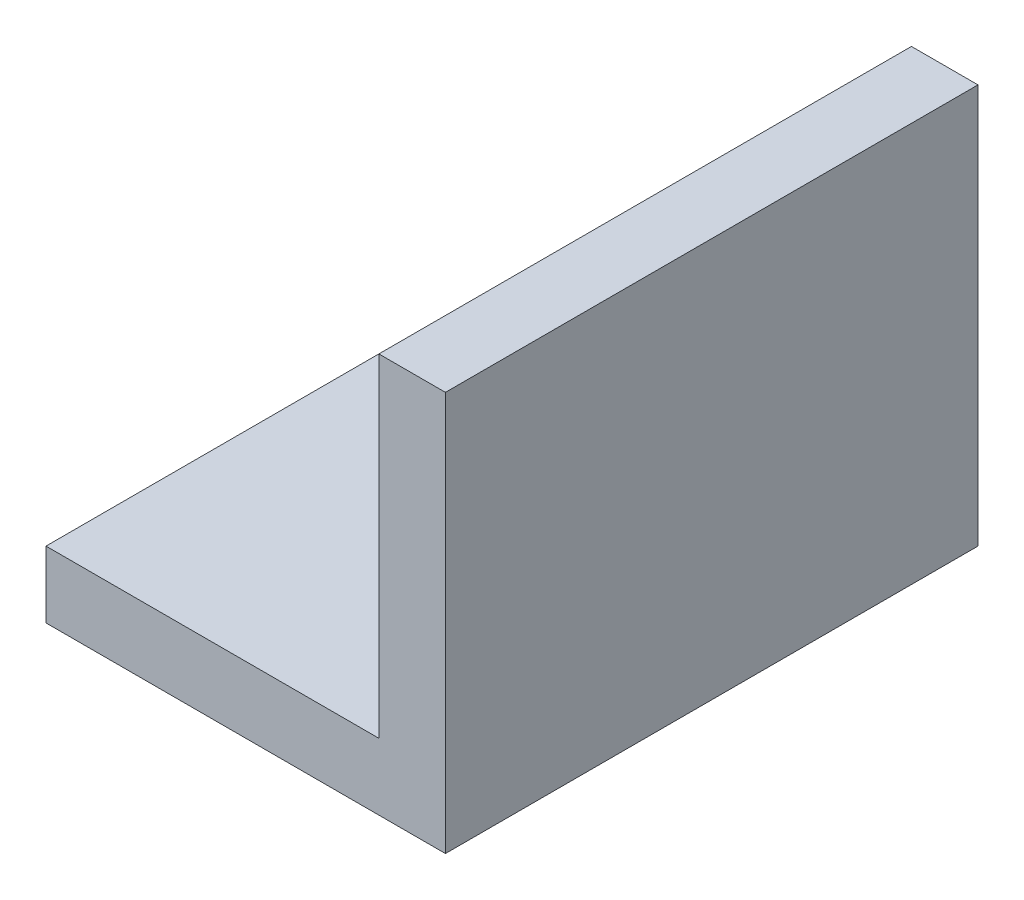
ISO-10303-21;
HEADER;
FILE_DESCRIPTION(('STEP AP214'),'2;1');
FILE_NAME('part.step','',(''),(''),'','','');
FILE_SCHEMA(('AUTOMOTIVE_DESIGN { 1 0 10303 214 1 1 1 1 }'));
ENDSEC;
DATA;
#1=APPLICATION_CONTEXT('core data for automotive mechanical design processes');
#2=APPLICATION_PROTOCOL_DEFINITION('international standard','automotive_design',2000,#1);
#3=PRODUCT_CONTEXT('',#1,'mechanical');
#4=PRODUCT('Part','Part','',(#3));
#5=PRODUCT_RELATED_PRODUCT_CATEGORY('part','',(#4));
#6=PRODUCT_DEFINITION_FORMATION('','',#4);
#7=PRODUCT_DEFINITION_CONTEXT('part definition',#1,'design');
#8=PRODUCT_DEFINITION('design','',#6,#7);
#9=PRODUCT_DEFINITION_SHAPE('','',#8);
#10=(LENGTH_UNIT() NAMED_UNIT(*) SI_UNIT(.MILLI.,.METRE.));
#11=(NAMED_UNIT(*) PLANE_ANGLE_UNIT() SI_UNIT($,.RADIAN.));
#12=(NAMED_UNIT(*) SI_UNIT($,.STERADIAN.) SOLID_ANGLE_UNIT());
#13=UNCERTAINTY_MEASURE_WITH_UNIT(LENGTH_MEASURE(1.E-05),#10,'distance_accuracy_value','');
#14=(GEOMETRIC_REPRESENTATION_CONTEXT(3) GLOBAL_UNCERTAINTY_ASSIGNED_CONTEXT((#13)) GLOBAL_UNIT_ASSIGNED_CONTEXT((#10,
#11,#12)) REPRESENTATION_CONTEXT('',''));
#15=CARTESIAN_POINT('',(0.,0.,0.));
#16=DIRECTION('',(0.,0.,1.));
#17=DIRECTION('',(1.,0.,0.));
#18=AXIS2_PLACEMENT_3D('',#15,#16,#17);
#19=CARTESIAN_POINT('',(0.,0.,25.4));
#20=DIRECTION('',(1.,0.,0.));
#21=DIRECTION('',(0.,0.,-1.));
#22=AXIS2_PLACEMENT_3D('',#19,#20,#21);
#23=PLANE('',#22);
#24=DIRECTION('',(0.,-1.,0.));
#25=VECTOR('',#24,1.);
#26=CARTESIAN_POINT('',(0.,0.,0.));
#27=LINE('',#26,#25);
#28=CARTESIAN_POINT('',(0.,3.175,0.));
#29=VERTEX_POINT('',#28);
#30=CARTESIAN_POINT('',(0.,0.,0.));
#31=VERTEX_POINT('',#30);
#32=EDGE_CURVE('E117',#29,#31,#27,.T.);
#33=ORIENTED_EDGE('',*,*,#32,.T.);
#34=DIRECTION('',(0.,0.,-1.));
#35=VECTOR('',#34,1.);
#36=CARTESIAN_POINT('',(0.,0.,25.4));
#37=LINE('',#36,#35);
#38=CARTESIAN_POINT('',(0.,0.,25.4));
#39=VERTEX_POINT('',#38);
#40=EDGE_CURVE('E11',#39,#31,#37,.T.);
#41=ORIENTED_EDGE('',*,*,#40,.F.);
#42=DIRECTION('',(0.,-1.,0.));
#43=VECTOR('',#42,1.);
#44=CARTESIAN_POINT('',(0.,0.,25.4));
#45=LINE('',#44,#43);
#46=CARTESIAN_POINT('',(0.,3.175,25.4));
#47=VERTEX_POINT('',#46);
#48=EDGE_CURVE('E127',#47,#39,#45,.T.);
#49=ORIENTED_EDGE('',*,*,#48,.F.);
#50=DIRECTION('',(0.,0.,-1.));
#51=VECTOR('',#50,1.);
#52=CARTESIAN_POINT('',(0.,3.175,25.4));
#53=LINE('',#52,#51);
#54=EDGE_CURVE('E113',#47,#29,#53,.T.);
#55=ORIENTED_EDGE('',*,*,#54,.T.);
#56=EDGE_LOOP('',(#33,#41,#49,#55));
#57=FACE_BOUND('',#56,.T.);
#58=ADVANCED_FACE('F33',(#57),#23,.F.);
#59=CARTESIAN_POINT('',(0.,0.,25.4));
#60=DIRECTION('',(0.,1.,0.));
#61=DIRECTION('',(0.,0.,1.));
#62=AXIS2_PLACEMENT_3D('',#59,#60,#61);
#63=PLANE('',#62);
#64=DIRECTION('',(1.,0.,0.));
#65=VECTOR('',#64,1.);
#66=CARTESIAN_POINT('',(0.,0.,0.));
#67=LINE('',#66,#65);
#68=CARTESIAN_POINT('',(19.05,0.,0.));
#69=VERTEX_POINT('',#68);
#70=EDGE_CURVE('E120',#31,#69,#67,.T.);
#71=ORIENTED_EDGE('',*,*,#70,.T.);
#72=DIRECTION('',(0.,0.,-1.));
#73=VECTOR('',#72,1.);
#74=CARTESIAN_POINT('',(19.05,0.,25.4));
#75=LINE('',#74,#73);
#76=CARTESIAN_POINT('',(19.05,0.,25.4));
#77=VERTEX_POINT('',#76);
#78=EDGE_CURVE('E41',#77,#69,#75,.T.);
#79=ORIENTED_EDGE('',*,*,#78,.F.);
#80=DIRECTION('',(1.,0.,0.));
#81=VECTOR('',#80,1.);
#82=CARTESIAN_POINT('',(0.,0.,25.4));
#83=LINE('',#82,#81);
#84=EDGE_CURVE('E86',#39,#77,#83,.T.);
#85=ORIENTED_EDGE('',*,*,#84,.F.);
#86=ORIENTED_EDGE('',*,*,#40,.T.);
#87=EDGE_LOOP('',(#71,#79,#85,#86));
#88=FACE_BOUND('',#87,.T.);
#89=ADVANCED_FACE('F151',(#88),#63,.F.);
#90=CARTESIAN_POINT('',(19.05,0.,25.4));
#91=DIRECTION('',(-1.,0.,0.));
#92=DIRECTION('',(0.,0.,1.));
#93=AXIS2_PLACEMENT_3D('',#90,#91,#92);
#94=PLANE('',#93);
#95=DIRECTION('',(0.,1.,0.));
#96=VECTOR('',#95,1.);
#97=CARTESIAN_POINT('',(19.05,0.,0.));
#98=LINE('',#97,#96);
#99=CARTESIAN_POINT('',(19.05,19.05,0.));
#100=VERTEX_POINT('',#99);
#101=EDGE_CURVE('E122',#69,#100,#98,.T.);
#102=ORIENTED_EDGE('',*,*,#101,.T.);
#103=DIRECTION('',(0.,0.,-1.));
#104=VECTOR('',#103,1.);
#105=CARTESIAN_POINT('',(19.05,19.05,25.4));
#106=LINE('',#105,#104);
#107=CARTESIAN_POINT('',(19.05,19.05,25.4));
#108=VERTEX_POINT('',#107);
#109=EDGE_CURVE('E108',#108,#100,#106,.T.);
#110=ORIENTED_EDGE('',*,*,#109,.F.);
#111=DIRECTION('',(0.,1.,0.));
#112=VECTOR('',#111,1.);
#113=CARTESIAN_POINT('',(19.05,0.,25.4));
#114=LINE('',#113,#112);
#115=EDGE_CURVE('E99',#77,#108,#114,.T.);
#116=ORIENTED_EDGE('',*,*,#115,.F.);
#117=ORIENTED_EDGE('',*,*,#78,.T.);
#118=EDGE_LOOP('',(#102,#110,#116,#117));
#119=FACE_BOUND('',#118,.T.);
#120=ADVANCED_FACE('F133',(#119),#94,.F.);
#121=CARTESIAN_POINT('',(19.05,19.05,25.4));
#122=DIRECTION('',(0.,-1.,0.));
#123=DIRECTION('',(0.,0.,-1.));
#124=AXIS2_PLACEMENT_3D('',#121,#122,#123);
#125=PLANE('',#124);
#126=DIRECTION('',(-1.,0.,0.));
#127=VECTOR('',#126,1.);
#128=CARTESIAN_POINT('',(19.05,19.05,0.));
#129=LINE('',#128,#127);
#130=CARTESIAN_POINT('',(15.875,19.05,0.));
#131=VERTEX_POINT('',#130);
#132=EDGE_CURVE('E107',#100,#131,#129,.T.);
#133=ORIENTED_EDGE('',*,*,#132,.T.);
#134=DIRECTION('',(0.,0.,-1.));
#135=VECTOR('',#134,1.);
#136=CARTESIAN_POINT('',(15.875,19.05,25.4));
#137=LINE('',#136,#135);
#138=CARTESIAN_POINT('',(15.875,19.05,25.4));
#139=VERTEX_POINT('',#138);
#140=EDGE_CURVE('E104',#139,#131,#137,.T.);
#141=ORIENTED_EDGE('',*,*,#140,.F.);
#142=DIRECTION('',(-1.,0.,0.));
#143=VECTOR('',#142,1.);
#144=CARTESIAN_POINT('',(19.05,19.05,25.4));
#145=LINE('',#144,#143);
#146=EDGE_CURVE('E93',#108,#139,#145,.T.);
#147=ORIENTED_EDGE('',*,*,#146,.F.);
#148=ORIENTED_EDGE('',*,*,#109,.T.);
#149=EDGE_LOOP('',(#133,#141,#147,#148));
#150=FACE_BOUND('',#149,.T.);
#151=ADVANCED_FACE('F105',(#150),#125,.F.);
#152=CARTESIAN_POINT('',(15.875,3.175,25.4));
#153=DIRECTION('',(1.,0.,0.));
#154=DIRECTION('',(0.,0.,-1.));
#155=AXIS2_PLACEMENT_3D('',#152,#153,#154);
#156=PLANE('',#155);
#157=DIRECTION('',(0.,-1.,0.));
#158=VECTOR('',#157,1.);
#159=CARTESIAN_POINT('',(15.875,3.175,0.));
#160=LINE('',#159,#158);
#161=CARTESIAN_POINT('',(15.875,3.175,0.));
#162=VERTEX_POINT('',#161);
#163=EDGE_CURVE('E72',#131,#162,#160,.T.);
#164=ORIENTED_EDGE('',*,*,#163,.T.);
#165=DIRECTION('',(0.,0.,-1.));
#166=VECTOR('',#165,1.);
#167=CARTESIAN_POINT('',(15.875,3.175,25.4));
#168=LINE('',#167,#166);
#169=CARTESIAN_POINT('',(15.875,3.175,25.4));
#170=VERTEX_POINT('',#169);
#171=EDGE_CURVE('E109',#170,#162,#168,.T.);
#172=ORIENTED_EDGE('',*,*,#171,.F.);
#173=DIRECTION('',(0.,-1.,0.));
#174=VECTOR('',#173,1.);
#175=CARTESIAN_POINT('',(15.875,3.175,25.4));
#176=LINE('',#175,#174);
#177=EDGE_CURVE('E97',#139,#170,#176,.T.);
#178=ORIENTED_EDGE('',*,*,#177,.F.);
#179=ORIENTED_EDGE('',*,*,#140,.T.);
#180=EDGE_LOOP('',(#164,#172,#178,#179));
#181=FACE_BOUND('',#180,.T.);
#182=ADVANCED_FACE('F111',(#181),#156,.F.);
#183=CARTESIAN_POINT('',(0.,3.175,25.4));
#184=DIRECTION('',(0.,-1.,0.));
#185=DIRECTION('',(0.,0.,-1.));
#186=AXIS2_PLACEMENT_3D('',#183,#184,#185);
#187=PLANE('',#186);
#188=DIRECTION('',(-1.,0.,0.));
#189=VECTOR('',#188,1.);
#190=CARTESIAN_POINT('',(0.,3.175,0.));
#191=LINE('',#190,#189);
#192=EDGE_CURVE('E78',#162,#29,#191,.T.);
#193=ORIENTED_EDGE('',*,*,#192,.T.);
#194=ORIENTED_EDGE('',*,*,#54,.F.);
#195=DIRECTION('',(-1.,0.,0.));
#196=VECTOR('',#195,1.);
#197=CARTESIAN_POINT('',(0.,3.175,25.4));
#198=LINE('',#197,#196);
#199=EDGE_CURVE('E49',#170,#47,#198,.T.);
#200=ORIENTED_EDGE('',*,*,#199,.F.);
#201=ORIENTED_EDGE('',*,*,#171,.T.);
#202=EDGE_LOOP('',(#193,#194,#200,#201));
#203=FACE_BOUND('',#202,.T.);
#204=ADVANCED_FACE('F140',(#203),#187,.F.);
#205=CARTESIAN_POINT('',(0.,0.,25.4));
#206=DIRECTION('',(0.,0.,-1.));
#207=DIRECTION('',(-1.,0.,0.));
#208=AXIS2_PLACEMENT_3D('',#205,#206,#207);
#209=PLANE('',#208);
#210=ORIENTED_EDGE('',*,*,#48,.T.);
#211=ORIENTED_EDGE('',*,*,#84,.T.);
#212=ORIENTED_EDGE('',*,*,#115,.T.);
#213=ORIENTED_EDGE('',*,*,#146,.T.);
#214=ORIENTED_EDGE('',*,*,#177,.T.);
#215=ORIENTED_EDGE('',*,*,#199,.T.);
#216=EDGE_LOOP('',(#210,#211,#212,#213,#214,#215));
#217=FACE_BOUND('',#216,.T.);
#218=ADVANCED_FACE('F95',(#217),#209,.F.);
#219=CARTESIAN_POINT('',(0.,0.,0.));
#220=DIRECTION('',(0.,0.,-1.));
#221=DIRECTION('',(-1.,0.,0.));
#222=AXIS2_PLACEMENT_3D('',#219,#220,#221);
#223=PLANE('',#222);
#224=ORIENTED_EDGE('',*,*,#32,.F.);
#225=ORIENTED_EDGE('',*,*,#192,.F.);
#226=ORIENTED_EDGE('',*,*,#163,.F.);
#227=ORIENTED_EDGE('',*,*,#132,.F.);
#228=ORIENTED_EDGE('',*,*,#101,.F.);
#229=ORIENTED_EDGE('',*,*,#70,.F.);
#230=EDGE_LOOP('',(#224,#225,#226,#227,#228,#229));
#231=FACE_BOUND('',#230,.T.);
#232=ADVANCED_FACE('F136',(#231),#223,.T.);
#233=CLOSED_SHELL('',(#58,#89,#120,#151,#182,#204,#218,#232));
#234=MANIFOLD_SOLID_BREP('B2',#233);
#235=ADVANCED_BREP_SHAPE_REPRESENTATION('',(#18,#234),#14);
#236=SHAPE_DEFINITION_REPRESENTATION(#9,#235);
ENDSEC;
END-ISO-10303-21;
